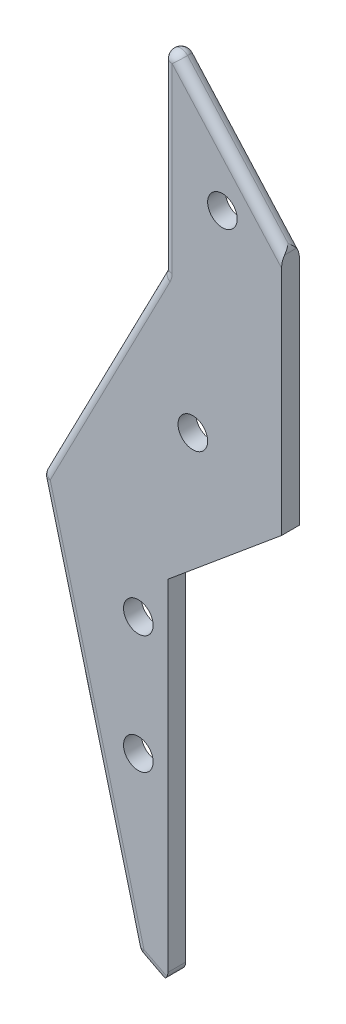
ISO-10303-21;
HEADER;
FILE_DESCRIPTION(('STEP AP214'),'2;1');
FILE_NAME('part.step','',(''),(''),'','','');
FILE_SCHEMA(('AUTOMOTIVE_DESIGN { 1 0 10303 214 1 1 1 1 }'));
ENDSEC;
DATA;
#1=APPLICATION_CONTEXT('core data for automotive mechanical design processes');
#2=APPLICATION_PROTOCOL_DEFINITION('international standard','automotive_design',2000,#1);
#3=PRODUCT_CONTEXT('',#1,'mechanical');
#4=PRODUCT('Part','Part','',(#3));
#5=PRODUCT_RELATED_PRODUCT_CATEGORY('part','',(#4));
#6=PRODUCT_DEFINITION_FORMATION('','',#4);
#7=PRODUCT_DEFINITION_CONTEXT('part definition',#1,'design');
#8=PRODUCT_DEFINITION('design','',#6,#7);
#9=PRODUCT_DEFINITION_SHAPE('','',#8);
#10=(LENGTH_UNIT() NAMED_UNIT(*) SI_UNIT(.MILLI.,.METRE.));
#11=(NAMED_UNIT(*) PLANE_ANGLE_UNIT() SI_UNIT($,.RADIAN.));
#12=(NAMED_UNIT(*) SI_UNIT($,.STERADIAN.) SOLID_ANGLE_UNIT());
#13=UNCERTAINTY_MEASURE_WITH_UNIT(LENGTH_MEASURE(1.E-05),#10,'distance_accuracy_value','');
#14=(GEOMETRIC_REPRESENTATION_CONTEXT(3) GLOBAL_UNCERTAINTY_ASSIGNED_CONTEXT((#13)) GLOBAL_UNIT_ASSIGNED_CONTEXT((#10,
#11,#12)) REPRESENTATION_CONTEXT('',''));
#15=CARTESIAN_POINT('',(0.,0.,0.));
#16=DIRECTION('',(0.,0.,1.));
#17=DIRECTION('',(1.,0.,0.));
#18=AXIS2_PLACEMENT_3D('',#15,#16,#17);
#19=CARTESIAN_POINT('',(-24.2126694308702,-104.063023886942,3.));
#20=DIRECTION('',(-1.,0.,0.));
#21=DIRECTION('',(0.,-1.,0.));
#22=AXIS2_PLACEMENT_3D('',#19,#20,#21);
#23=PLANE('',#22);
#24=DIRECTION('',(0.,1.,0.));
#25=VECTOR('',#24,1.);
#26=CARTESIAN_POINT('',(-24.2126694308702,-104.063023886942,3.));
#27=LINE('',#26,#25);
#28=CARTESIAN_POINT('',(-24.2126694308702,-101.59740540995,3.));
#29=VERTEX_POINT('',#28);
#30=CARTESIAN_POINT('',(-24.2126694308702,-44.0630238869422,3.));
#31=VERTEX_POINT('',#30);
#32=EDGE_CURVE('E191',#29,#31,#27,.T.);
#33=ORIENTED_EDGE('',*,*,#32,.F.);
#34=DIRECTION('',(0.,0.,-1.));
#35=VECTOR('',#34,1.);
#36=CARTESIAN_POINT('',(-24.2126694308702,-101.59740540995,3.));
#37=LINE('',#36,#35);
#38=CARTESIAN_POINT('',(-24.2126694308702,-101.59740540995,0.));
#39=VERTEX_POINT('',#38);
#40=EDGE_CURVE('E150',#29,#39,#37,.T.);
#41=ORIENTED_EDGE('',*,*,#40,.T.);
#42=DIRECTION('',(0.,1.,0.));
#43=VECTOR('',#42,1.);
#44=CARTESIAN_POINT('',(-24.2126694308702,-104.063023886942,0.));
#45=LINE('',#44,#43);
#46=CARTESIAN_POINT('',(-24.2126694308702,-44.0630238869422,0.));
#47=VERTEX_POINT('',#46);
#48=EDGE_CURVE('E137',#39,#47,#45,.T.);
#49=ORIENTED_EDGE('',*,*,#48,.T.);
#50=DIRECTION('',(0.,0.,-1.));
#51=VECTOR('',#50,1.);
#52=CARTESIAN_POINT('',(-24.2126694308702,-44.0630238869422,3.));
#53=LINE('',#52,#51);
#54=EDGE_CURVE('E210',#31,#47,#53,.T.);
#55=ORIENTED_EDGE('',*,*,#54,.F.);
#56=EDGE_LOOP('',(#33,#41,#49,#55));
#57=FACE_BOUND('',#56,.T.);
#58=ADVANCED_FACE('F47',(#57),#23,.F.);
#59=CARTESIAN_POINT('',(-24.2126694308702,-44.0630238869422,3.));
#60=DIRECTION('',(-0.640000899244737,0.768374159486073,0.));
#61=DIRECTION('',(-0.768374159486073,-0.640000899244737,0.));
#62=AXIS2_PLACEMENT_3D('',#59,#60,#61);
#63=PLANE('',#62);
#64=DIRECTION('',(0.768374159486073,0.640000899244737,0.));
#65=VECTOR('',#64,1.);
#66=CARTESIAN_POINT('',(-24.2126694308702,-44.0630238869422,0.));
#67=LINE('',#66,#65);
#68=CARTESIAN_POINT('',(-5.00331544371835,-28.0630014058238,0.));
#69=VERTEX_POINT('',#68);
#70=EDGE_CURVE('E203',#47,#69,#67,.T.);
#71=ORIENTED_EDGE('',*,*,#70,.T.);
#72=DIRECTION('',(0.,0.,-1.));
#73=VECTOR('',#72,1.);
#74=CARTESIAN_POINT('',(-5.00331544371835,-28.0630014058238,3.));
#75=LINE('',#74,#73);
#76=CARTESIAN_POINT('',(-5.00331544371835,-28.0630014058238,3.));
#77=VERTEX_POINT('',#76);
#78=EDGE_CURVE('E201',#77,#69,#75,.T.);
#79=ORIENTED_EDGE('',*,*,#78,.F.);
#80=DIRECTION('',(0.768374159486073,0.640000899244737,0.));
#81=VECTOR('',#80,1.);
#82=CARTESIAN_POINT('',(-24.2126694308702,-44.0630238869422,3.));
#83=LINE('',#82,#81);
#84=EDGE_CURVE('E194',#31,#77,#83,.T.);
#85=ORIENTED_EDGE('',*,*,#84,.F.);
#86=ORIENTED_EDGE('',*,*,#54,.T.);
#87=EDGE_LOOP('',(#71,#79,#85,#86));
#88=FACE_BOUND('',#87,.T.);
#89=ADVANCED_FACE('F328',(#88),#63,.F.);
#90=CARTESIAN_POINT('',(-5.00331544371835,-28.0630014058238,3.));
#91=DIRECTION('',(-1.,0.,0.));
#92=DIRECTION('',(0.,-1.,0.));
#93=AXIS2_PLACEMENT_3D('',#90,#91,#92);
#94=PLANE('',#93);
#95=DIRECTION('',(0.,0.,-1.));
#96=VECTOR('',#95,1.);
#97=CARTESIAN_POINT('',(-5.00331544371834,12.7261830349934,3.));
#98=LINE('',#97,#96);
#99=CARTESIAN_POINT('',(-5.00331544371834,12.7261830349934,0.5));
#100=VERTEX_POINT('',#99);
#101=CARTESIAN_POINT('',(-5.00331544371834,12.7261830349934,2.5));
#102=VERTEX_POINT('',#101);
#103=EDGE_CURVE('E216',#100,#102,#98,.F.);
#104=ORIENTED_EDGE('',*,*,#103,.T.);
#105=CARTESIAN_POINT('',(-5.00331544371834,11.0491320518685,1.5));
#106=DIRECTION('',(-1.,0.,0.));
#107=DIRECTION('',(0.,1.,0.));
#108=AXIS2_PLACEMENT_3D('',#105,#106,#107);
#109=ELLIPSE('',#108,2.25,1.5);
#110=CARTESIAN_POINT('',(-5.00331544371835,11.0491320518685,3.));
#111=VERTEX_POINT('',#110);
#112=EDGE_CURVE('E219',#102,#111,#109,.F.);
#113=ORIENTED_EDGE('',*,*,#112,.T.);
#114=DIRECTION('',(0.,1.,0.));
#115=VECTOR('',#114,1.);
#116=CARTESIAN_POINT('',(-5.00331544371835,-28.0630014058238,3.));
#117=LINE('',#116,#115);
#118=EDGE_CURVE('E198',#77,#111,#117,.T.);
#119=ORIENTED_EDGE('',*,*,#118,.F.);
#120=ORIENTED_EDGE('',*,*,#78,.T.);
#121=DIRECTION('',(0.,1.,0.));
#122=VECTOR('',#121,1.);
#123=CARTESIAN_POINT('',(-5.00331544371835,-28.0630014058238,0.));
#124=LINE('',#123,#122);
#125=CARTESIAN_POINT('',(-5.00331544371835,11.0491320518685,0.));
#126=VERTEX_POINT('',#125);
#127=EDGE_CURVE('E195',#69,#126,#124,.T.);
#128=ORIENTED_EDGE('',*,*,#127,.T.);
#129=CARTESIAN_POINT('',(-5.00331544371835,11.0491320518685,1.5));
#130=DIRECTION('',(-1.,0.,0.));
#131=DIRECTION('',(0.,-1.,0.));
#132=AXIS2_PLACEMENT_3D('',#129,#130,#131);
#133=ELLIPSE('',#132,2.25,1.5);
#134=EDGE_CURVE('E213',#126,#100,#133,.F.);
#135=ORIENTED_EDGE('',*,*,#134,.T.);
#136=EDGE_LOOP('',(#104,#113,#119,#120,#128,#135));
#137=FACE_BOUND('',#136,.T.);
#138=ADVANCED_FACE('F336',(#137),#94,.F.);
#139=CARTESIAN_POINT('',(0.,0.,3.));
#140=DIRECTION('',(0.,0.,-1.));
#141=DIRECTION('',(-1.,0.,0.));
#142=AXIS2_PLACEMENT_3D('',#139,#140,#141);
#143=PLANE('',#142);
#144=CARTESIAN_POINT('',(-29.2126694308702,-52.0630238869422,3.));
#145=DIRECTION('',(0.,0.,1.));
#146=DIRECTION('',(1.,0.,0.));
#147=AXIS2_PLACEMENT_3D('',#144,#145,#146);
#148=CIRCLE('',#147,2.5);
#149=CARTESIAN_POINT('',(-26.7126694308702,-52.0630238869422,3.));
#150=VERTEX_POINT('',#149);
#151=EDGE_CURVE('E167',#150,#150,#148,.T.);
#152=ORIENTED_EDGE('',*,*,#151,.F.);
#153=EDGE_LOOP('',(#152));
#154=FACE_BOUND('',#153,.T.);
#155=CARTESIAN_POINT('',(-29.2126694308702,-72.0630238869422,3.));
#156=DIRECTION('',(0.,0.,1.));
#157=DIRECTION('',(1.,0.,0.));
#158=AXIS2_PLACEMENT_3D('',#155,#156,#157);
#159=CIRCLE('',#158,2.5);
#160=CARTESIAN_POINT('',(-26.7126694308702,-72.0630238869422,3.));
#161=VERTEX_POINT('',#160);
#162=EDGE_CURVE('E171',#161,#161,#159,.T.);
#163=ORIENTED_EDGE('',*,*,#162,.F.);
#164=EDGE_LOOP('',(#163));
#165=FACE_BOUND('',#164,.T.);
#166=DIRECTION('',(0.888055190639969,-0.459736857753878,0.));
#167=VECTOR('',#166,1.);
#168=CARTESIAN_POINT('',(-46.9139235421523,-90.6217385276492,3.));
#169=LINE('',#168,#167);
#170=CARTESIAN_POINT('',(-28.2578998687383,-100.279766308126,3.));
#171=VERTEX_POINT('',#170);
#172=CARTESIAN_POINT('',(-24.3805866449102,-102.287010696581,3.));
#173=VERTEX_POINT('',#172);
#174=EDGE_CURVE('E66',#171,#173,#169,.T.);
#175=ORIENTED_EDGE('',*,*,#174,.T.);
#176=CARTESIAN_POINT('',(-25.7126694308702,-101.59740540995,3.));
#177=DIRECTION('',(0.,0.,-1.));
#178=DIRECTION('',(-1.,0.,0.));
#179=AXIS2_PLACEMENT_3D('',#176,#177,#178);
#180=CIRCLE('',#179,1.5);
#181=EDGE_CURVE('E307',#173,#29,#180,.F.);
#182=ORIENTED_EDGE('',*,*,#181,.T.);
#183=ORIENTED_EDGE('',*,*,#32,.T.);
#184=ORIENTED_EDGE('',*,*,#84,.T.);
#185=ORIENTED_EDGE('',*,*,#118,.T.);
#186=DIRECTION('',(-0.666666666666667,0.74535599249993,0.));
#187=VECTOR('',#186,1.);
#188=CARTESIAN_POINT('',(2.71073816690086,2.4245579241574,3.));
#189=LINE('',#188,#187);
#190=CARTESIAN_POINT('',(-23.5033154437183,31.7327608437416,3.));
#191=VERTEX_POINT('',#190);
#192=EDGE_CURVE('E233',#111,#191,#189,.T.);
#193=ORIENTED_EDGE('',*,*,#192,.T.);
#194=DIRECTION('',(0.,-1.,0.));
#195=VECTOR('',#194,1.);
#196=CARTESIAN_POINT('',(-23.5033154437183,0.,3.));
#197=LINE('',#196,#195);
#198=CARTESIAN_POINT('',(-23.5033154437183,1.02505818727446,3.));
#199=VERTEX_POINT('',#198);
#200=EDGE_CURVE('E225',#191,#199,#197,.T.);
#201=ORIENTED_EDGE('',*,*,#200,.T.);
#202=CARTESIAN_POINT('',(-26.5033154437183,1.02505818727446,3.));
#203=DIRECTION('',(0.,0.,-1.));
#204=DIRECTION('',(-1.,0.,0.));
#205=AXIS2_PLACEMENT_3D('',#202,#203,#204);
#206=CIRCLE('',#205,3.);
#207=CARTESIAN_POINT('',(-23.8391498717984,-0.35415238598717,3.));
#208=VERTEX_POINT('',#207);
#209=EDGE_CURVE('E222',#208,#199,#206,.F.);
#210=ORIENTED_EDGE('',*,*,#209,.F.);
#211=DIRECTION('',(-0.459736857753877,-0.888055190639969,0.));
#212=VECTOR('',#211,1.);
#213=CARTESIAN_POINT('',(-18.6559649509613,9.65799738047877,3.));
#214=LINE('',#213,#212);
#215=CARTESIAN_POINT('',(-44.0948817440299,-39.4813346554947,3.));
#216=VERTEX_POINT('',#215);
#217=EDGE_CURVE('E228',#208,#216,#214,.T.);
#218=ORIENTED_EDGE('',*,*,#217,.T.);
#219=DIRECTION('',(0.25207199125177,-0.967708484630763,0.));
#220=VECTOR('',#219,1.);
#221=CARTESIAN_POINT('',(-50.9238492304873,-13.2648171237557,3.));
#222=LINE('',#221,#220);
#223=EDGE_CURVE('E231',#216,#171,#222,.T.);
#224=ORIENTED_EDGE('',*,*,#223,.T.);
#225=EDGE_LOOP('',(#175,#182,#183,#184,#185,#193,#201,#210,#218,#224));
#226=FACE_BOUND('',#225,.T.);
#227=CARTESIAN_POINT('',(-20.0033154437183,-20.5205280606326,3.));
#228=DIRECTION('',(0.,0.,1.));
#229=DIRECTION('',(1.,0.,0.));
#230=AXIS2_PLACEMENT_3D('',#227,#228,#229);
#231=CIRCLE('',#230,2.5);
#232=CARTESIAN_POINT('',(-17.5033154437183,-20.5205280606326,3.));
#233=VERTEX_POINT('',#232);
#234=EDGE_CURVE('E182',#233,#233,#231,.T.);
#235=ORIENTED_EDGE('',*,*,#234,.F.);
#236=EDGE_LOOP('',(#235));
#237=FACE_BOUND('',#236,.T.);
#238=CARTESIAN_POINT('',(-15.0033154437183,14.4794719393675,3.));
#239=DIRECTION('',(0.,0.,1.));
#240=DIRECTION('',(1.,0.,0.));
#241=AXIS2_PLACEMENT_3D('',#238,#239,#240);
#242=CIRCLE('',#241,2.5);
#243=CARTESIAN_POINT('',(-12.5033154437183,14.4794719393675,3.));
#244=VERTEX_POINT('',#243);
#245=EDGE_CURVE('E181',#244,#244,#242,.T.);
#246=ORIENTED_EDGE('',*,*,#245,.F.);
#247=EDGE_LOOP('',(#246));
#248=FACE_BOUND('',#247,.T.);
#249=ADVANCED_FACE('F411',(#154,#165,#226,#237,#248),#143,.F.);
#250=CARTESIAN_POINT('',(0.,0.,0.));
#251=DIRECTION('',(0.,0.,-1.));
#252=DIRECTION('',(-1.,0.,0.));
#253=AXIS2_PLACEMENT_3D('',#250,#251,#252);
#254=PLANE('',#253);
#255=CARTESIAN_POINT('',(-29.2126694308702,-52.0630238869422,0.));
#256=DIRECTION('',(0.,0.,-1.));
#257=DIRECTION('',(-1.,0.,0.));
#258=AXIS2_PLACEMENT_3D('',#255,#256,#257);
#259=CIRCLE('',#258,2.5);
#260=CARTESIAN_POINT('',(-31.7126694308702,-52.0630238869422,0.));
#261=VERTEX_POINT('',#260);
#262=EDGE_CURVE('E51',#261,#261,#259,.T.);
#263=ORIENTED_EDGE('',*,*,#262,.F.);
#264=EDGE_LOOP('',(#263));
#265=FACE_BOUND('',#264,.T.);
#266=CARTESIAN_POINT('',(-29.2126694308702,-72.0630238869422,0.));
#267=DIRECTION('',(0.,0.,-1.));
#268=DIRECTION('',(-1.,0.,0.));
#269=AXIS2_PLACEMENT_3D('',#266,#267,#268);
#270=CIRCLE('',#269,2.5);
#271=CARTESIAN_POINT('',(-31.7126694308702,-72.0630238869422,0.));
#272=VERTEX_POINT('',#271);
#273=EDGE_CURVE('E158',#272,#272,#270,.T.);
#274=ORIENTED_EDGE('',*,*,#273,.F.);
#275=EDGE_LOOP('',(#274));
#276=FACE_BOUND('',#275,.T.);
#277=CARTESIAN_POINT('',(-20.0033154437183,-20.5205280606326,0.));
#278=DIRECTION('',(0.,0.,1.));
#279=DIRECTION('',(1.,0.,0.));
#280=AXIS2_PLACEMENT_3D('',#277,#278,#279);
#281=CIRCLE('',#280,2.5);
#282=CARTESIAN_POINT('',(-17.5033154437183,-20.5205280606326,0.));
#283=VERTEX_POINT('',#282);
#284=EDGE_CURVE('E178',#283,#283,#281,.T.);
#285=ORIENTED_EDGE('',*,*,#284,.T.);
#286=EDGE_LOOP('',(#285));
#287=FACE_BOUND('',#286,.T.);
#288=CARTESIAN_POINT('',(-15.0033154437183,14.4794719393675,0.));
#289=DIRECTION('',(0.,0.,1.));
#290=DIRECTION('',(1.,0.,0.));
#291=AXIS2_PLACEMENT_3D('',#288,#289,#290);
#292=CIRCLE('',#291,2.5);
#293=CARTESIAN_POINT('',(-12.5033154437183,14.4794719393675,0.));
#294=VERTEX_POINT('',#293);
#295=EDGE_CURVE('E186',#294,#294,#292,.T.);
#296=ORIENTED_EDGE('',*,*,#295,.T.);
#297=EDGE_LOOP('',(#296));
#298=FACE_BOUND('',#297,.T.);
#299=ORIENTED_EDGE('',*,*,#48,.F.);
#300=CARTESIAN_POINT('',(-25.7126694308702,-101.59740540995,0.));
#301=DIRECTION('',(0.,0.,-1.));
#302=DIRECTION('',(-1.,0.,0.));
#303=AXIS2_PLACEMENT_3D('',#300,#301,#302);
#304=CIRCLE('',#303,1.5);
#305=CARTESIAN_POINT('',(-24.3805866449102,-102.287010696581,0.));
#306=VERTEX_POINT('',#305);
#307=EDGE_CURVE('E129',#39,#306,#304,.T.);
#308=ORIENTED_EDGE('',*,*,#307,.T.);
#309=DIRECTION('',(0.888055190639969,-0.459736857753878,0.));
#310=VECTOR('',#309,1.);
#311=CARTESIAN_POINT('',(-27.0597375160687,-100.900042391078,0.));
#312=LINE('',#311,#310);
#313=CARTESIAN_POINT('',(-28.2578998687383,-100.279766308126,0.));
#314=VERTEX_POINT('',#313);
#315=EDGE_CURVE('E133',#306,#314,#312,.F.);
#316=ORIENTED_EDGE('',*,*,#315,.T.);
#317=DIRECTION('',(0.25207199125177,-0.967708484630763,0.));
#318=VECTOR('',#317,1.);
#319=CARTESIAN_POINT('',(-44.2399113156967,-38.9245637650546,0.));
#320=LINE('',#319,#318);
#321=CARTESIAN_POINT('',(-44.0948817440299,-39.4813346554947,0.));
#322=VERTEX_POINT('',#321);
#323=EDGE_CURVE('E245',#314,#322,#320,.F.);
#324=ORIENTED_EDGE('',*,*,#323,.T.);
#325=DIRECTION('',(-0.459736857753877,-0.888055190639969,0.));
#326=VECTOR('',#325,1.);
#327=CARTESIAN_POINT('',(-23.6712326577584,-0.0297934597644184,0.));
#328=LINE('',#327,#326);
#329=CARTESIAN_POINT('',(-23.8391498717984,-0.354152385987168,0.));
#330=VERTEX_POINT('',#329);
#331=EDGE_CURVE('E242',#322,#330,#328,.F.);
#332=ORIENTED_EDGE('',*,*,#331,.T.);
#333=CARTESIAN_POINT('',(-26.5033154437183,1.02505818727446,0.));
#334=DIRECTION('',(0.,0.,-1.));
#335=DIRECTION('',(-1.,0.,0.));
#336=AXIS2_PLACEMENT_3D('',#333,#334,#335);
#337=CIRCLE('',#336,3.);
#338=CARTESIAN_POINT('',(-23.5033154437183,1.02505818727446,0.));
#339=VERTEX_POINT('',#338);
#340=EDGE_CURVE('E239',#339,#330,#337,.T.);
#341=ORIENTED_EDGE('',*,*,#340,.F.);
#342=DIRECTION('',(0.,-1.,0.));
#343=VECTOR('',#342,1.);
#344=CARTESIAN_POINT('',(-23.5033154437183,35.6598118268664,0.));
#345=LINE('',#344,#343);
#346=CARTESIAN_POINT('',(-23.5033154437183,31.7327608437416,0.));
#347=VERTEX_POINT('',#346);
#348=EDGE_CURVE('E236',#339,#347,#345,.F.);
#349=ORIENTED_EDGE('',*,*,#348,.T.);
#350=DIRECTION('',(-0.666666666666667,0.74535599249993,0.));
#351=VECTOR('',#350,1.);
#352=CARTESIAN_POINT('',(-6.12134943246824,12.2991320518685,0.));
#353=LINE('',#352,#351);
#354=EDGE_CURVE('E247',#347,#126,#353,.F.);
#355=ORIENTED_EDGE('',*,*,#354,.T.);
#356=ORIENTED_EDGE('',*,*,#127,.F.);
#357=ORIENTED_EDGE('',*,*,#70,.F.);
#358=EDGE_LOOP('',(#299,#308,#316,#324,#332,#341,#349,#355,#356,#357));
#359=FACE_BOUND('',#358,.T.);
#360=ADVANCED_FACE('F131',(#265,#276,#287,#298,#359),#254,.T.);
#361=CARTESIAN_POINT('',(-15.0033154437183,14.4794719393675,0.));
#362=DIRECTION('',(0.,0.,1.));
#363=DIRECTION('',(1.,0.,0.));
#364=AXIS2_PLACEMENT_3D('',#361,#362,#363);
#365=CYLINDRICAL_SURFACE('',#364,2.5);
#366=ORIENTED_EDGE('',*,*,#295,.F.);
#367=EDGE_LOOP('',(#366));
#368=FACE_BOUND('',#367,.T.);
#369=ORIENTED_EDGE('',*,*,#245,.T.);
#370=EDGE_LOOP('',(#369));
#371=FACE_BOUND('',#370,.T.);
#372=ADVANCED_FACE('F423',(#368,#371),#365,.F.);
#373=CARTESIAN_POINT('',(-20.0033154437183,-20.5205280606326,0.));
#374=DIRECTION('',(0.,0.,1.));
#375=DIRECTION('',(1.,0.,0.));
#376=AXIS2_PLACEMENT_3D('',#373,#374,#375);
#377=CYLINDRICAL_SURFACE('',#376,2.5);
#378=ORIENTED_EDGE('',*,*,#284,.F.);
#379=EDGE_LOOP('',(#378));
#380=FACE_BOUND('',#379,.T.);
#381=ORIENTED_EDGE('',*,*,#234,.T.);
#382=EDGE_LOOP('',(#381));
#383=FACE_BOUND('',#382,.T.);
#384=ADVANCED_FACE('F394',(#380,#383),#377,.F.);
#385=CARTESIAN_POINT('',(-50.9238492304873,-13.2648171237557,1.5));
#386=DIRECTION('',(0.25207199125177,-0.967708484630763,0.));
#387=DIRECTION('',(0.967708484630763,0.25207199125177,0.));
#388=AXIS2_PLACEMENT_3D('',#385,#386,#387);
#389=CYLINDRICAL_SURFACE('',#388,1.5);
#390=DIRECTION('',(0.25207199125177,-0.967708484630763,0.));
#391=VECTOR('',#390,1.);
#392=CARTESIAN_POINT('',(-45.6914740426428,-39.3026717519322,1.5));
#393=LINE('',#392,#391);
#394=CARTESIAN_POINT('',(-29.7094625956844,-100.657874295004,1.5));
#395=VERTEX_POINT('',#394);
#396=CARTESIAN_POINT('',(-45.5464444709761,-39.8594426423724,1.5));
#397=VERTEX_POINT('',#396);
#398=EDGE_CURVE('E185',#395,#397,#393,.F.);
#399=ORIENTED_EDGE('',*,*,#398,.F.);
#400=CARTESIAN_POINT('',(-28.2578998687383,-100.279766308126,1.5));
#401=DIRECTION('',(0.25207199125177,-0.967708484630763,0.));
#402=DIRECTION('',(0.967708484630763,0.25207199125177,0.));
#403=AXIS2_PLACEMENT_3D('',#400,#401,#402);
#404=CIRCLE('',#403,1.5);
#405=EDGE_CURVE('E11',#395,#171,#404,.F.);
#406=ORIENTED_EDGE('',*,*,#405,.T.);
#407=ORIENTED_EDGE('',*,*,#223,.F.);
#408=CARTESIAN_POINT('',(-44.0948817440299,-39.4813346554947,1.5));
#409=DIRECTION('',(-0.252071991251768,0.967708484630764,0.));
#410=DIRECTION('',(-0.967708484630764,-0.252071991251768,0.));
#411=AXIS2_PLACEMENT_3D('',#408,#409,#410);
#412=CIRCLE('',#411,1.5);
#413=EDGE_CURVE('E300',#397,#216,#412,.T.);
#414=ORIENTED_EDGE('',*,*,#413,.F.);
#415=EDGE_LOOP('',(#399,#406,#407,#414));
#416=FACE_BOUND('',#415,.T.);
#417=ADVANCED_FACE('F316',(#416),#389,.T.);
#418=CARTESIAN_POINT('',(-44.2399113156967,-38.9245637650546,1.5));
#419=DIRECTION('',(-0.25207199125177,0.967708484630763,0.));
#420=DIRECTION('',(-0.967708484630763,-0.25207199125177,0.));
#421=AXIS2_PLACEMENT_3D('',#418,#419,#420);
#422=CYLINDRICAL_SURFACE('',#421,1.5);
#423=ORIENTED_EDGE('',*,*,#323,.F.);
#424=CARTESIAN_POINT('',(-28.2578998687383,-100.279766308126,1.5));
#425=DIRECTION('',(-0.25207199125177,0.967708484630763,0.));
#426=DIRECTION('',(-0.967708484630763,-0.25207199125177,0.));
#427=AXIS2_PLACEMENT_3D('',#424,#425,#426);
#428=CIRCLE('',#427,1.5);
#429=EDGE_CURVE('E57',#314,#395,#428,.T.);
#430=ORIENTED_EDGE('',*,*,#429,.T.);
#431=ORIENTED_EDGE('',*,*,#398,.T.);
#432=CARTESIAN_POINT('',(-44.0948817440299,-39.4813346554947,1.5));
#433=DIRECTION('',(-0.252071991251768,0.967708484630764,0.));
#434=DIRECTION('',(-0.967708484630764,-0.252071991251768,0.));
#435=AXIS2_PLACEMENT_3D('',#432,#433,#434);
#436=CIRCLE('',#435,1.5);
#437=EDGE_CURVE('E295',#322,#397,#436,.T.);
#438=ORIENTED_EDGE('',*,*,#437,.F.);
#439=EDGE_LOOP('',(#423,#430,#431,#438));
#440=FACE_BOUND('',#439,.T.);
#441=ADVANCED_FACE('F311',(#440),#422,.T.);
#442=CARTESIAN_POINT('',(-44.0948817440299,-39.4813346554947,1.5));
#443=DIRECTION('',(0.,0.,1.));
#444=DIRECTION('',(1.,0.,0.));
#445=AXIS2_PLACEMENT_3D('',#442,#443,#444);
#446=SPHERICAL_SURFACE('',#445,1.5);
#447=CARTESIAN_POINT('',(-44.0948817440299,-39.4813346554947,1.5));
#448=DIRECTION('',(0.,0.,1.));
#449=DIRECTION('',(1.,0.,0.));
#450=AXIS2_PLACEMENT_3D('',#447,#448,#449);
#451=CIRCLE('',#450,1.5);
#452=CARTESIAN_POINT('',(-45.4269645299899,-38.7917293688639,1.5));
#453=VERTEX_POINT('',#452);
#454=EDGE_CURVE('E298',#453,#397,#451,.T.);
#455=ORIENTED_EDGE('',*,*,#454,.T.);
#456=ORIENTED_EDGE('',*,*,#413,.T.);
#457=CARTESIAN_POINT('',(-44.0948817440299,-39.4813346554947,1.5));
#458=DIRECTION('',(-0.459736857753878,-0.888055190639968,0.));
#459=DIRECTION('',(0.888055190639968,-0.459736857753878,0.));
#460=AXIS2_PLACEMENT_3D('',#457,#458,#459);
#461=CIRCLE('',#460,1.5);
#462=EDGE_CURVE('E292',#453,#216,#461,.F.);
#463=ORIENTED_EDGE('',*,*,#462,.F.);
#464=EDGE_LOOP('',(#455,#456,#463));
#465=FACE_BOUND('',#464,.T.);
#466=ADVANCED_FACE('F386',(#465),#446,.T.);
#467=CARTESIAN_POINT('',(-44.0948817440299,-39.4813346554947,1.5));
#468=DIRECTION('',(0.,0.,1.));
#469=DIRECTION('',(1.,0.,0.));
#470=AXIS2_PLACEMENT_3D('',#467,#468,#469);
#471=SPHERICAL_SURFACE('',#470,1.5);
#472=ORIENTED_EDGE('',*,*,#437,.T.);
#473=ORIENTED_EDGE('',*,*,#454,.F.);
#474=CARTESIAN_POINT('',(-44.0948817440299,-39.4813346554947,1.5));
#475=DIRECTION('',(-0.459736857753878,-0.888055190639968,0.));
#476=DIRECTION('',(0.888055190639968,-0.459736857753878,0.));
#477=AXIS2_PLACEMENT_3D('',#474,#475,#476);
#478=CIRCLE('',#477,1.5);
#479=EDGE_CURVE('E286',#322,#453,#478,.F.);
#480=ORIENTED_EDGE('',*,*,#479,.F.);
#481=EDGE_LOOP('',(#472,#473,#480));
#482=FACE_BOUND('',#481,.T.);
#483=ADVANCED_FACE('F382',(#482),#471,.T.);
#484=CARTESIAN_POINT('',(-18.6559649509613,9.65799738047878,1.5));
#485=DIRECTION('',(-0.459736857753877,-0.888055190639969,0.));
#486=DIRECTION('',(0.888055190639969,-0.459736857753877,0.));
#487=AXIS2_PLACEMENT_3D('',#484,#485,#486);
#488=CYLINDRICAL_SURFACE('',#487,1.5);
#489=CARTESIAN_POINT('',(-23.8391498717984,-0.354152385987168,1.5));
#490=DIRECTION('',(0.459736857753878,0.888055190639969,0.));
#491=DIRECTION('',(-0.888055190639969,0.459736857753878,0.));
#492=AXIS2_PLACEMENT_3D('',#489,#490,#491);
#493=CIRCLE('',#492,1.5);
#494=CARTESIAN_POINT('',(-25.1712326577584,0.335452900643648,1.5));
#495=VERTEX_POINT('',#494);
#496=EDGE_CURVE('E283',#495,#208,#493,.T.);
#497=ORIENTED_EDGE('',*,*,#496,.F.);
#498=DIRECTION('',(-0.459736857753877,-0.888055190639969,0.));
#499=VECTOR('',#498,1.);
#500=CARTESIAN_POINT('',(-25.0033154437183,0.659811826866397,1.5));
#501=LINE('',#500,#499);
#502=EDGE_CURVE('E289',#453,#495,#501,.F.);
#503=ORIENTED_EDGE('',*,*,#502,.F.);
#504=ORIENTED_EDGE('',*,*,#462,.T.);
#505=ORIENTED_EDGE('',*,*,#217,.F.);
#506=EDGE_LOOP('',(#497,#503,#504,#505));
#507=FACE_BOUND('',#506,.T.);
#508=ADVANCED_FACE('F378',(#507),#488,.T.);
#509=CARTESIAN_POINT('',(-23.6712326577584,-0.0297934597644189,1.5));
#510=DIRECTION('',(0.459736857753877,0.888055190639969,0.));
#511=DIRECTION('',(-0.888055190639969,0.459736857753877,0.));
#512=AXIS2_PLACEMENT_3D('',#509,#510,#511);
#513=CYLINDRICAL_SURFACE('',#512,1.5);
#514=ORIENTED_EDGE('',*,*,#479,.T.);
#515=ORIENTED_EDGE('',*,*,#502,.T.);
#516=CARTESIAN_POINT('',(-23.8391498717984,-0.354152385987168,1.5));
#517=DIRECTION('',(0.459736857753878,0.888055190639969,0.));
#518=DIRECTION('',(-0.888055190639969,0.459736857753878,0.));
#519=AXIS2_PLACEMENT_3D('',#516,#517,#518);
#520=CIRCLE('',#519,1.5);
#521=EDGE_CURVE('E278',#330,#495,#520,.T.);
#522=ORIENTED_EDGE('',*,*,#521,.F.);
#523=ORIENTED_EDGE('',*,*,#331,.F.);
#524=EDGE_LOOP('',(#514,#515,#522,#523));
#525=FACE_BOUND('',#524,.T.);
#526=ADVANCED_FACE('F374',(#525),#513,.T.);
#527=CARTESIAN_POINT('',(-26.5033154437183,1.02505818727446,1.5));
#528=DIRECTION('',(0.,0.,-1.));
#529=DIRECTION('',(-1.,0.,0.));
#530=AXIS2_PLACEMENT_3D('',#527,#528,#529);
#531=TOROIDAL_SURFACE('',#530,3.,1.5);
#532=ORIENTED_EDGE('',*,*,#496,.T.);
#533=ORIENTED_EDGE('',*,*,#209,.T.);
#534=CARTESIAN_POINT('',(-23.5033154437183,1.02505818727446,1.5));
#535=DIRECTION('',(0.,-1.,0.));
#536=DIRECTION('',(1.,0.,0.));
#537=AXIS2_PLACEMENT_3D('',#534,#535,#536);
#538=CIRCLE('',#537,1.5);
#539=CARTESIAN_POINT('',(-25.0033154437183,1.02505818727446,1.5));
#540=VERTEX_POINT('',#539);
#541=EDGE_CURVE('E275',#540,#199,#538,.F.);
#542=ORIENTED_EDGE('',*,*,#541,.F.);
#543=CARTESIAN_POINT('',(-26.5033154437183,1.02505818727446,1.5));
#544=DIRECTION('',(0.,0.,-1.));
#545=DIRECTION('',(-1.,0.,0.));
#546=AXIS2_PLACEMENT_3D('',#543,#544,#545);
#547=CIRCLE('',#546,1.5);
#548=EDGE_CURVE('E281',#540,#495,#547,.T.);
#549=ORIENTED_EDGE('',*,*,#548,.T.);
#550=EDGE_LOOP('',(#532,#533,#542,#549));
#551=FACE_BOUND('',#550,.T.);
#552=ADVANCED_FACE('F370',(#551),#531,.T.);
#553=CARTESIAN_POINT('',(-26.5033154437183,1.02505818727446,1.5));
#554=DIRECTION('',(0.,0.,-1.));
#555=DIRECTION('',(-1.,0.,0.));
#556=AXIS2_PLACEMENT_3D('',#553,#554,#555);
#557=TOROIDAL_SURFACE('',#556,3.,1.5);
#558=ORIENTED_EDGE('',*,*,#521,.T.);
#559=ORIENTED_EDGE('',*,*,#548,.F.);
#560=CARTESIAN_POINT('',(-23.5033154437183,1.02505818727446,1.5));
#561=DIRECTION('',(0.,-1.,0.));
#562=DIRECTION('',(1.,0.,0.));
#563=AXIS2_PLACEMENT_3D('',#560,#561,#562);
#564=CIRCLE('',#563,1.5);
#565=EDGE_CURVE('E269',#339,#540,#564,.F.);
#566=ORIENTED_EDGE('',*,*,#565,.F.);
#567=ORIENTED_EDGE('',*,*,#340,.T.);
#568=EDGE_LOOP('',(#558,#559,#566,#567));
#569=FACE_BOUND('',#568,.T.);
#570=ADVANCED_FACE('F366',(#569),#557,.T.);
#571=CARTESIAN_POINT('',(-23.5033154437183,0.,1.5));
#572=DIRECTION('',(0.,-1.,0.));
#573=DIRECTION('',(1.,0.,0.));
#574=AXIS2_PLACEMENT_3D('',#571,#572,#573);
#575=CYLINDRICAL_SURFACE('',#574,1.5);
#576=CARTESIAN_POINT('',(-23.5033154437183,31.7327608437416,1.5));
#577=DIRECTION('',(0.,1.,0.));
#578=DIRECTION('',(0.,0.,1.));
#579=AXIS2_PLACEMENT_3D('',#576,#577,#578);
#580=CIRCLE('',#579,1.5);
#581=CARTESIAN_POINT('',(-25.0033154437183,31.7327608437416,1.5));
#582=VERTEX_POINT('',#581);
#583=EDGE_CURVE('E266',#582,#191,#580,.T.);
#584=ORIENTED_EDGE('',*,*,#583,.F.);
#585=DIRECTION('',(0.,-1.,0.));
#586=VECTOR('',#585,1.);
#587=CARTESIAN_POINT('',(-25.0033154437183,35.6598118268664,1.5));
#588=LINE('',#587,#586);
#589=EDGE_CURVE('E272',#540,#582,#588,.F.);
#590=ORIENTED_EDGE('',*,*,#589,.F.);
#591=ORIENTED_EDGE('',*,*,#541,.T.);
#592=ORIENTED_EDGE('',*,*,#200,.F.);
#593=EDGE_LOOP('',(#584,#590,#591,#592));
#594=FACE_BOUND('',#593,.T.);
#595=ADVANCED_FACE('F362',(#594),#575,.T.);
#596=CARTESIAN_POINT('',(-23.5033154437183,35.6598118268664,1.5));
#597=DIRECTION('',(0.,1.,0.));
#598=DIRECTION('',(-1.,0.,0.));
#599=AXIS2_PLACEMENT_3D('',#596,#597,#598);
#600=CYLINDRICAL_SURFACE('',#599,1.5);
#601=ORIENTED_EDGE('',*,*,#565,.T.);
#602=ORIENTED_EDGE('',*,*,#589,.T.);
#603=CARTESIAN_POINT('',(-23.5033154437183,31.7327608437416,1.5));
#604=DIRECTION('',(0.,1.,0.));
#605=DIRECTION('',(0.,0.,1.));
#606=AXIS2_PLACEMENT_3D('',#603,#604,#605);
#607=CIRCLE('',#606,1.5);
#608=EDGE_CURVE('E261',#347,#582,#607,.T.);
#609=ORIENTED_EDGE('',*,*,#608,.F.);
#610=ORIENTED_EDGE('',*,*,#348,.F.);
#611=EDGE_LOOP('',(#601,#602,#609,#610));
#612=FACE_BOUND('',#611,.T.);
#613=ADVANCED_FACE('F358',(#612),#600,.T.);
#614=CARTESIAN_POINT('',(-23.5033154437183,31.7327608437416,1.5));
#615=DIRECTION('',(0.,0.,1.));
#616=DIRECTION('',(1.,0.,0.));
#617=AXIS2_PLACEMENT_3D('',#614,#615,#616);
#618=SPHERICAL_SURFACE('',#617,1.5);
#619=CARTESIAN_POINT('',(-23.5033154437183,31.7327608437416,1.5));
#620=DIRECTION('',(0.,0.,1.));
#621=DIRECTION('',(1.,0.,0.));
#622=AXIS2_PLACEMENT_3D('',#619,#620,#621);
#623=CIRCLE('',#622,1.5);
#624=CARTESIAN_POINT('',(-22.3852814549684,32.7327608437416,1.5));
#625=VERTEX_POINT('',#624);
#626=EDGE_CURVE('E264',#625,#582,#623,.T.);
#627=ORIENTED_EDGE('',*,*,#626,.T.);
#628=ORIENTED_EDGE('',*,*,#583,.T.);
#629=CARTESIAN_POINT('',(-23.5033154437183,31.7327608437416,1.5));
#630=DIRECTION('',(-0.666666666666667,0.74535599249993,0.));
#631=DIRECTION('',(-0.74535599249993,-0.666666666666667,0.));
#632=AXIS2_PLACEMENT_3D('',#629,#630,#631);
#633=CIRCLE('',#632,1.5);
#634=EDGE_CURVE('E258',#625,#191,#633,.F.);
#635=ORIENTED_EDGE('',*,*,#634,.F.);
#636=EDGE_LOOP('',(#627,#628,#635));
#637=FACE_BOUND('',#636,.T.);
#638=ADVANCED_FACE('F354',(#637),#618,.T.);
#639=CARTESIAN_POINT('',(-23.5033154437183,31.7327608437416,1.5));
#640=DIRECTION('',(0.,0.,1.));
#641=DIRECTION('',(1.,0.,0.));
#642=AXIS2_PLACEMENT_3D('',#639,#640,#641);
#643=SPHERICAL_SURFACE('',#642,1.5);
#644=ORIENTED_EDGE('',*,*,#608,.T.);
#645=ORIENTED_EDGE('',*,*,#626,.F.);
#646=CARTESIAN_POINT('',(-23.5033154437183,31.7327608437416,1.5));
#647=DIRECTION('',(-0.666666666666667,0.74535599249993,0.));
#648=DIRECTION('',(-0.74535599249993,-0.666666666666667,0.));
#649=AXIS2_PLACEMENT_3D('',#646,#647,#648);
#650=CIRCLE('',#649,1.5);
#651=EDGE_CURVE('E255',#347,#625,#650,.F.);
#652=ORIENTED_EDGE('',*,*,#651,.F.);
#653=EDGE_LOOP('',(#644,#645,#652));
#654=FACE_BOUND('',#653,.T.);
#655=ADVANCED_FACE('F350',(#654),#643,.T.);
#656=CARTESIAN_POINT('',(2.71073816690086,2.4245579241574,1.5));
#657=DIRECTION('',(-0.666666666666667,0.74535599249993,0.));
#658=DIRECTION('',(-0.74535599249993,-0.666666666666667,0.));
#659=AXIS2_PLACEMENT_3D('',#656,#657,#658);
#660=CYLINDRICAL_SURFACE('',#659,1.5);
#661=DIRECTION('',(-0.666666666666667,0.74535599249993,0.));
#662=VECTOR('',#661,1.);
#663=CARTESIAN_POINT('',(-5.00331544371834,13.2991320518685,1.5));
#664=LINE('',#663,#662);
#665=CARTESIAN_POINT('',(-5.38528145496845,13.7261830349934,1.5));
#666=VERTEX_POINT('',#665);
#667=EDGE_CURVE('E92',#625,#666,#664,.F.);
#668=ORIENTED_EDGE('',*,*,#667,.F.);
#669=ORIENTED_EDGE('',*,*,#634,.T.);
#670=ORIENTED_EDGE('',*,*,#192,.F.);
#671=ORIENTED_EDGE('',*,*,#112,.F.);
#672=CARTESIAN_POINT('',(-6.50331544371834,12.7261830349934,1.5));
#673=DIRECTION('',(-0.471404520791032,0.52704627669473,0.707106781186547));
#674=DIRECTION('',(-0.471404520791032,0.52704627669473,-0.707106781186547));
#675=AXIS2_PLACEMENT_3D('',#672,#673,#674);
#676=ELLIPSE('',#675,2.12132034355964,1.5);
#677=EDGE_CURVE('E252',#666,#102,#676,.F.);
#678=ORIENTED_EDGE('',*,*,#677,.F.);
#679=EDGE_LOOP('',(#668,#669,#670,#671,#678));
#680=FACE_BOUND('',#679,.T.);
#681=ADVANCED_FACE('F347',(#680),#660,.T.);
#682=CARTESIAN_POINT('',(-6.12134943246824,12.2991320518685,1.5));
#683=DIRECTION('',(0.666666666666667,-0.74535599249993,0.));
#684=DIRECTION('',(0.74535599249993,0.666666666666667,0.));
#685=AXIS2_PLACEMENT_3D('',#682,#683,#684);
#686=CYLINDRICAL_SURFACE('',#685,1.5);
#687=ORIENTED_EDGE('',*,*,#651,.T.);
#688=ORIENTED_EDGE('',*,*,#667,.T.);
#689=CARTESIAN_POINT('',(-6.50331544371835,12.7261830349934,1.5));
#690=DIRECTION('',(0.471404520791032,-0.52704627669473,0.707106781186547));
#691=DIRECTION('',(0.471404520791032,-0.52704627669473,-0.707106781186547));
#692=AXIS2_PLACEMENT_3D('',#689,#690,#691);
#693=ELLIPSE('',#692,2.12132034355964,1.5);
#694=EDGE_CURVE('E165',#100,#666,#693,.T.);
#695=ORIENTED_EDGE('',*,*,#694,.F.);
#696=ORIENTED_EDGE('',*,*,#134,.F.);
#697=ORIENTED_EDGE('',*,*,#354,.F.);
#698=EDGE_LOOP('',(#687,#688,#695,#696,#697));
#699=FACE_BOUND('',#698,.T.);
#700=ADVANCED_FACE('F343',(#699),#686,.T.);
#701=CARTESIAN_POINT('',(-6.50331544371835,12.7261830349934,3.));
#702=DIRECTION('',(0.,0.,-1.));
#703=DIRECTION('',(-1.,0.,0.));
#704=AXIS2_PLACEMENT_3D('',#701,#702,#703);
#705=CYLINDRICAL_SURFACE('',#704,1.5);
#706=ORIENTED_EDGE('',*,*,#677,.T.);
#707=ORIENTED_EDGE('',*,*,#103,.F.);
#708=ORIENTED_EDGE('',*,*,#694,.T.);
#709=EDGE_LOOP('',(#706,#707,#708));
#710=FACE_BOUND('',#709,.T.);
#711=ADVANCED_FACE('F326',(#710),#705,.T.);
#712=CARTESIAN_POINT('',(-28.2578998687383,-100.279766308126,1.5));
#713=DIRECTION('',(0.459736857753877,0.888055190639968,0.));
#714=DIRECTION('',(-0.888055190639969,0.459736857753878,0.));
#715=AXIS2_PLACEMENT_3D('',#712,#713,#714);
#716=SPHERICAL_SURFACE('',#715,1.5);
#717=CARTESIAN_POINT('',(-28.2578998687383,-100.279766308126,1.5));
#718=DIRECTION('',(0.888055190639966,-0.459736857753882,0.));
#719=DIRECTION('',(0.459736857753882,0.888055190639966,0.));
#720=AXIS2_PLACEMENT_3D('',#717,#718,#719);
#721=CIRCLE('',#720,1.5);
#722=CARTESIAN_POINT('',(-28.9475051553691,-101.611849094086,1.5));
#723=VERTEX_POINT('',#722);
#724=EDGE_CURVE('E163',#171,#723,#721,.T.);
#725=ORIENTED_EDGE('',*,*,#724,.F.);
#726=ORIENTED_EDGE('',*,*,#405,.F.);
#727=CARTESIAN_POINT('',(-28.2578998687383,-100.279766308126,1.5));
#728=DIRECTION('',(0.,0.,-1.));
#729=DIRECTION('',(-1.,0.,0.));
#730=AXIS2_PLACEMENT_3D('',#727,#728,#729);
#731=CIRCLE('',#730,1.5);
#732=EDGE_CURVE('E84',#723,#395,#731,.T.);
#733=ORIENTED_EDGE('',*,*,#732,.F.);
#734=EDGE_LOOP('',(#725,#726,#733));
#735=FACE_BOUND('',#734,.T.);
#736=ADVANCED_FACE('F49',(#735),#716,.T.);
#737=CARTESIAN_POINT('',(-28.2578998687383,-100.279766308126,1.5));
#738=DIRECTION('',(0.459736857753877,0.888055190639968,0.));
#739=DIRECTION('',(-0.888055190639969,0.459736857753878,0.));
#740=AXIS2_PLACEMENT_3D('',#737,#738,#739);
#741=SPHERICAL_SURFACE('',#740,1.5);
#742=ORIENTED_EDGE('',*,*,#732,.T.);
#743=ORIENTED_EDGE('',*,*,#429,.F.);
#744=CARTESIAN_POINT('',(-28.2578998687383,-100.279766308126,1.5));
#745=DIRECTION('',(0.888055190639968,-0.459736857753879,0.));
#746=DIRECTION('',(0.459736857753879,0.888055190639968,0.));
#747=AXIS2_PLACEMENT_3D('',#744,#745,#746);
#748=CIRCLE('',#747,1.5);
#749=EDGE_CURVE('E149',#723,#314,#748,.T.);
#750=ORIENTED_EDGE('',*,*,#749,.F.);
#751=EDGE_LOOP('',(#742,#743,#750));
#752=FACE_BOUND('',#751,.T.);
#753=ADVANCED_FACE('F318',(#752),#741,.T.);
#754=CARTESIAN_POINT('',(-46.9139235421523,-90.6217385276492,1.5));
#755=DIRECTION('',(0.888055190639969,-0.459736857753878,0.));
#756=DIRECTION('',(0.459736857753878,0.888055190639969,0.));
#757=AXIS2_PLACEMENT_3D('',#754,#755,#756);
#758=CYLINDRICAL_SURFACE('',#757,1.5);
#759=ORIENTED_EDGE('',*,*,#174,.F.);
#760=ORIENTED_EDGE('',*,*,#724,.T.);
#761=DIRECTION('',(0.888055190639969,-0.459736857753878,0.));
#762=VECTOR('',#761,1.);
#763=CARTESIAN_POINT('',(-29.54100057471,-101.304602740419,1.5));
#764=LINE('',#763,#762);
#765=CARTESIAN_POINT('',(-26.402274717501,-102.92948819591,1.5));
#766=VERTEX_POINT('',#765);
#767=EDGE_CURVE('E76',#766,#723,#764,.F.);
#768=ORIENTED_EDGE('',*,*,#767,.F.);
#769=CARTESIAN_POINT('',(-25.7126694308702,-101.59740540995,1.5));
#770=DIRECTION('',(0.627949847369434,-0.325083049679162,-0.707106781186547));
#771=DIRECTION('',(0.627949847369434,-0.325083049679162,0.707106781186547));
#772=AXIS2_PLACEMENT_3D('',#769,#770,#771);
#773=ELLIPSE('',#772,2.12132034355964,1.5);
#774=EDGE_CURVE('E154',#173,#766,#773,.T.);
#775=ORIENTED_EDGE('',*,*,#774,.F.);
#776=EDGE_LOOP('',(#759,#760,#768,#775));
#777=FACE_BOUND('',#776,.T.);
#778=ADVANCED_FACE('F320',(#777),#758,.T.);
#779=CARTESIAN_POINT('',(-28.8513952880792,-99.972519954459,1.5));
#780=DIRECTION('',(-0.888055190639969,0.459736857753878,0.));
#781=DIRECTION('',(-0.459736857753878,-0.888055190639969,0.));
#782=AXIS2_PLACEMENT_3D('',#779,#780,#781);
#783=CYLINDRICAL_SURFACE('',#782,1.5);
#784=ORIENTED_EDGE('',*,*,#749,.T.);
#785=ORIENTED_EDGE('',*,*,#315,.F.);
#786=CARTESIAN_POINT('',(-25.7126694308702,-101.59740540995,1.5));
#787=DIRECTION('',(-0.627949847369434,0.325083049679162,-0.707106781186547));
#788=DIRECTION('',(-0.627949847369434,0.325083049679162,0.707106781186547));
#789=AXIS2_PLACEMENT_3D('',#786,#787,#788);
#790=ELLIPSE('',#789,2.12132034355964,1.5);
#791=EDGE_CURVE('E147',#766,#306,#790,.F.);
#792=ORIENTED_EDGE('',*,*,#791,.F.);
#793=ORIENTED_EDGE('',*,*,#767,.T.);
#794=EDGE_LOOP('',(#784,#785,#792,#793));
#795=FACE_BOUND('',#794,.T.);
#796=ADVANCED_FACE('F146',(#795),#783,.T.);
#797=CARTESIAN_POINT('',(-25.7126694308702,-101.59740540995,3.));
#798=DIRECTION('',(0.,0.,-1.));
#799=DIRECTION('',(-1.,0.,0.));
#800=AXIS2_PLACEMENT_3D('',#797,#798,#799);
#801=CYLINDRICAL_SURFACE('',#800,1.5);
#802=ORIENTED_EDGE('',*,*,#181,.F.);
#803=ORIENTED_EDGE('',*,*,#774,.T.);
#804=ORIENTED_EDGE('',*,*,#791,.T.);
#805=ORIENTED_EDGE('',*,*,#307,.F.);
#806=ORIENTED_EDGE('',*,*,#40,.F.);
#807=EDGE_LOOP('',(#802,#803,#804,#805,#806));
#808=FACE_BOUND('',#807,.T.);
#809=ADVANCED_FACE('F153',(#808),#801,.T.);
#810=CARTESIAN_POINT('',(-29.2126694308702,-72.0630238869422,-2.));
#811=DIRECTION('',(0.,0.,1.));
#812=DIRECTION('',(1.,0.,0.));
#813=AXIS2_PLACEMENT_3D('',#810,#811,#812);
#814=CYLINDRICAL_SURFACE('',#813,2.5);
#815=ORIENTED_EDGE('',*,*,#273,.T.);
#816=EDGE_LOOP('',(#815));
#817=FACE_BOUND('',#816,.T.);
#818=ORIENTED_EDGE('',*,*,#162,.T.);
#819=EDGE_LOOP('',(#818));
#820=FACE_BOUND('',#819,.T.);
#821=ADVANCED_FACE('F397',(#817,#820),#814,.F.);
#822=CARTESIAN_POINT('',(-29.2126694308702,-52.0630238869422,-2.));
#823=DIRECTION('',(0.,0.,1.));
#824=DIRECTION('',(1.,0.,0.));
#825=AXIS2_PLACEMENT_3D('',#822,#823,#824);
#826=CYLINDRICAL_SURFACE('',#825,2.5);
#827=ORIENTED_EDGE('',*,*,#262,.T.);
#828=EDGE_LOOP('',(#827));
#829=FACE_BOUND('',#828,.T.);
#830=ORIENTED_EDGE('',*,*,#151,.T.);
#831=EDGE_LOOP('',(#830));
#832=FACE_BOUND('',#831,.T.);
#833=ADVANCED_FACE('F431',(#829,#832),#826,.F.);
#834=CLOSED_SHELL('',(#58,#89,#138,#249,#360,#372,#384,#417,#441,#466,#483,#508,#526,#552,#570,
#595,#613,#638,#655,#681,#700,#711,#736,#753,#778,#796,#809,#821,#833));
#835=MANIFOLD_SOLID_BREP('B2',#834);
#836=ADVANCED_BREP_SHAPE_REPRESENTATION('',(#18,#835),#14);
#837=SHAPE_DEFINITION_REPRESENTATION(#9,#836);
ENDSEC;
END-ISO-10303-21;
